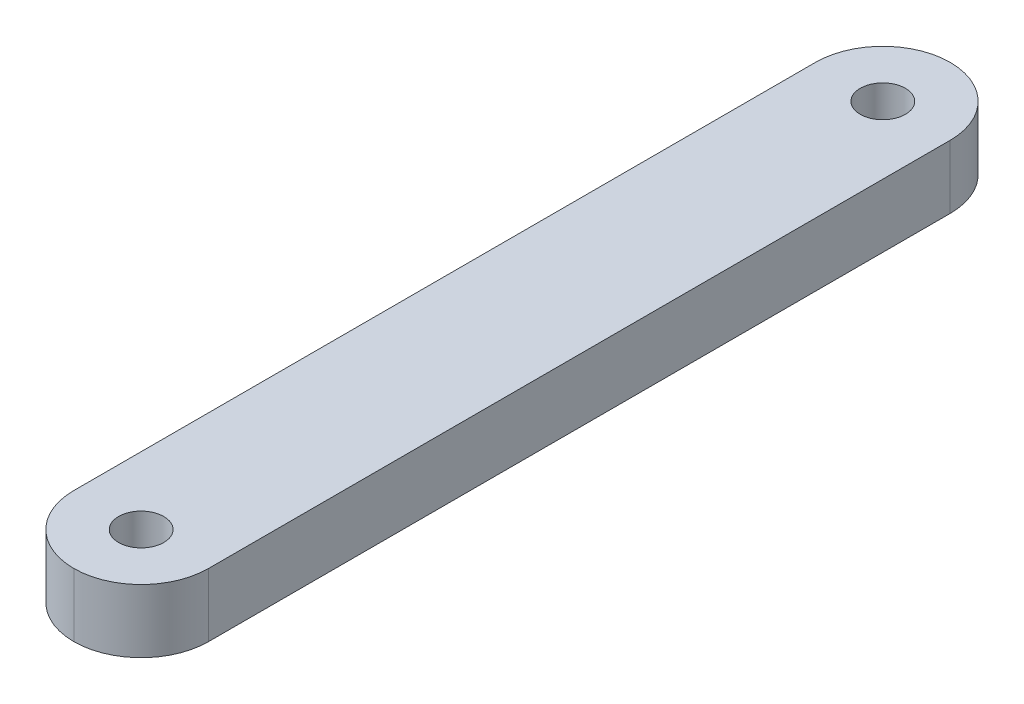
ISO-10303-21;
HEADER;
FILE_DESCRIPTION(('STEP AP214'),'2;1');
FILE_NAME('part.step','',(''),(''),'','','');
FILE_SCHEMA(('AUTOMOTIVE_DESIGN { 1 0 10303 214 1 1 1 1 }'));
ENDSEC;
DATA;
#1=APPLICATION_CONTEXT('core data for automotive mechanical design processes');
#2=APPLICATION_PROTOCOL_DEFINITION('international standard','automotive_design',2000,#1);
#3=PRODUCT_CONTEXT('',#1,'mechanical');
#4=PRODUCT('Part','Part','',(#3));
#5=PRODUCT_RELATED_PRODUCT_CATEGORY('part','',(#4));
#6=PRODUCT_DEFINITION_FORMATION('','',#4);
#7=PRODUCT_DEFINITION_CONTEXT('part definition',#1,'design');
#8=PRODUCT_DEFINITION('design','',#6,#7);
#9=PRODUCT_DEFINITION_SHAPE('','',#8);
#10=(LENGTH_UNIT() NAMED_UNIT(*) SI_UNIT(.MILLI.,.METRE.));
#11=(NAMED_UNIT(*) PLANE_ANGLE_UNIT() SI_UNIT($,.RADIAN.));
#12=(NAMED_UNIT(*) SI_UNIT($,.STERADIAN.) SOLID_ANGLE_UNIT());
#13=UNCERTAINTY_MEASURE_WITH_UNIT(LENGTH_MEASURE(1.E-05),#10,'distance_accuracy_value','');
#14=(GEOMETRIC_REPRESENTATION_CONTEXT(3) GLOBAL_UNCERTAINTY_ASSIGNED_CONTEXT((#13)) GLOBAL_UNIT_ASSIGNED_CONTEXT((#10,
#11,#12)) REPRESENTATION_CONTEXT('',''));
#15=CARTESIAN_POINT('',(0.,0.,0.));
#16=DIRECTION('',(0.,0.,1.));
#17=DIRECTION('',(1.,0.,0.));
#18=AXIS2_PLACEMENT_3D('',#15,#16,#17);
#19=CARTESIAN_POINT('',(0.,0.,65.));
#20=DIRECTION('',(1.,0.,0.));
#21=DIRECTION('',(0.,0.,-1.));
#22=AXIS2_PLACEMENT_3D('',#19,#20,#21);
#23=PLANE('',#22);
#24=DIRECTION('',(0.,0.,1.));
#25=VECTOR('',#24,1.);
#26=CARTESIAN_POINT('',(0.,4.7,65.));
#27=LINE('',#26,#25);
#28=CARTESIAN_POINT('',(0.,4.7,5.));
#29=VERTEX_POINT('',#28);
#30=CARTESIAN_POINT('',(0.,4.7,60.));
#31=VERTEX_POINT('',#30);
#32=EDGE_CURVE('E87',#29,#31,#27,.T.);
#33=ORIENTED_EDGE('',*,*,#32,.F.);
#34=DIRECTION('',(0.,-1.,0.));
#35=VECTOR('',#34,1.);
#36=CARTESIAN_POINT('',(0.,0.,5.));
#37=LINE('',#36,#35);
#38=CARTESIAN_POINT('',(0.,0.,5.));
#39=VERTEX_POINT('',#38);
#40=EDGE_CURVE('E56',#29,#39,#37,.T.);
#41=ORIENTED_EDGE('',*,*,#40,.T.);
#42=DIRECTION('',(0.,0.,-1.));
#43=VECTOR('',#42,1.);
#44=CARTESIAN_POINT('',(0.,0.,65.));
#45=LINE('',#44,#43);
#46=CARTESIAN_POINT('',(0.,0.,60.));
#47=VERTEX_POINT('',#46);
#48=EDGE_CURVE('E135',#47,#39,#45,.T.);
#49=ORIENTED_EDGE('',*,*,#48,.F.);
#50=DIRECTION('',(0.,-1.,0.));
#51=VECTOR('',#50,1.);
#52=CARTESIAN_POINT('',(0.,0.,60.));
#53=LINE('',#52,#51);
#54=EDGE_CURVE('E93',#47,#31,#53,.F.);
#55=ORIENTED_EDGE('',*,*,#54,.T.);
#56=EDGE_LOOP('',(#33,#41,#49,#55));
#57=FACE_BOUND('',#56,.T.);
#58=ADVANCED_FACE('F34',(#57),#23,.F.);
#59=CARTESIAN_POINT('',(10.,0.,65.));
#60=DIRECTION('',(-1.,0.,0.));
#61=DIRECTION('',(0.,0.,1.));
#62=AXIS2_PLACEMENT_3D('',#59,#60,#61);
#63=PLANE('',#62);
#64=DIRECTION('',(0.,0.,-1.));
#65=VECTOR('',#64,1.);
#66=CARTESIAN_POINT('',(10.,4.7,65.));
#67=LINE('',#66,#65);
#68=CARTESIAN_POINT('',(10.,4.7,60.));
#69=VERTEX_POINT('',#68);
#70=CARTESIAN_POINT('',(10.,4.7,5.));
#71=VERTEX_POINT('',#70);
#72=EDGE_CURVE('E95',#69,#71,#67,.T.);
#73=ORIENTED_EDGE('',*,*,#72,.F.);
#74=DIRECTION('',(0.,1.,0.));
#75=VECTOR('',#74,1.);
#76=CARTESIAN_POINT('',(10.,0.,60.));
#77=LINE('',#76,#75);
#78=CARTESIAN_POINT('',(10.,0.,60.));
#79=VERTEX_POINT('',#78);
#80=EDGE_CURVE('E42',#69,#79,#77,.F.);
#81=ORIENTED_EDGE('',*,*,#80,.T.);
#82=DIRECTION('',(0.,0.,-1.));
#83=VECTOR('',#82,1.);
#84=CARTESIAN_POINT('',(10.,0.,65.));
#85=LINE('',#84,#83);
#86=CARTESIAN_POINT('',(10.,0.,5.));
#87=VERTEX_POINT('',#86);
#88=EDGE_CURVE('E132',#79,#87,#85,.T.);
#89=ORIENTED_EDGE('',*,*,#88,.T.);
#90=DIRECTION('',(0.,1.,0.));
#91=VECTOR('',#90,1.);
#92=CARTESIAN_POINT('',(10.,5.,5.));
#93=LINE('',#92,#91);
#94=EDGE_CURVE('E103',#87,#71,#93,.T.);
#95=ORIENTED_EDGE('',*,*,#94,.T.);
#96=EDGE_LOOP('',(#73,#81,#89,#95));
#97=FACE_BOUND('',#96,.T.);
#98=ADVANCED_FACE('F159',(#97),#63,.F.);
#99=CARTESIAN_POINT('',(5.,-35.,60.));
#100=DIRECTION('',(0.,1.,0.));
#101=DIRECTION('',(0.,0.,1.));
#102=AXIS2_PLACEMENT_3D('',#99,#100,#101);
#103=CYLINDRICAL_SURFACE('',#102,1.675);
#104=CARTESIAN_POINT('',(5.,0.,60.));
#105=DIRECTION('',(0.,1.,0.));
#106=DIRECTION('',(0.,0.,1.));
#107=AXIS2_PLACEMENT_3D('',#104,#105,#106);
#108=CIRCLE('',#107,1.675);
#109=CARTESIAN_POINT('',(5.,0.,61.675));
#110=VERTEX_POINT('',#109);
#111=EDGE_CURVE('E114',#110,#110,#108,.T.);
#112=ORIENTED_EDGE('',*,*,#111,.F.);
#113=EDGE_LOOP('',(#112));
#114=FACE_BOUND('',#113,.T.);
#115=CARTESIAN_POINT('',(5.,4.7,60.));
#116=DIRECTION('',(0.,1.,0.));
#117=DIRECTION('',(0.,0.,1.));
#118=AXIS2_PLACEMENT_3D('',#115,#116,#117);
#119=CIRCLE('',#118,1.675);
#120=CARTESIAN_POINT('',(5.,4.7,61.675));
#121=VERTEX_POINT('',#120);
#122=EDGE_CURVE('E116',#121,#121,#119,.F.);
#123=ORIENTED_EDGE('',*,*,#122,.F.);
#124=EDGE_LOOP('',(#123));
#125=FACE_BOUND('',#124,.T.);
#126=ADVANCED_FACE('F161',(#114,#125),#103,.F.);
#127=CARTESIAN_POINT('',(5.,-35.,5.));
#128=DIRECTION('',(0.,1.,0.));
#129=DIRECTION('',(0.,0.,1.));
#130=AXIS2_PLACEMENT_3D('',#127,#128,#129);
#131=CYLINDRICAL_SURFACE('',#130,1.675);
#132=CARTESIAN_POINT('',(5.,0.,5.));
#133=DIRECTION('',(0.,1.,0.));
#134=DIRECTION('',(0.,0.,1.));
#135=AXIS2_PLACEMENT_3D('',#132,#133,#134);
#136=CIRCLE('',#135,1.675);
#137=CARTESIAN_POINT('',(5.,0.,6.675));
#138=VERTEX_POINT('',#137);
#139=EDGE_CURVE('E129',#138,#138,#136,.T.);
#140=ORIENTED_EDGE('',*,*,#139,.F.);
#141=EDGE_LOOP('',(#140));
#142=FACE_BOUND('',#141,.T.);
#143=CARTESIAN_POINT('',(5.,4.7,5.));
#144=DIRECTION('',(0.,1.,0.));
#145=DIRECTION('',(0.,0.,1.));
#146=AXIS2_PLACEMENT_3D('',#143,#144,#145);
#147=CIRCLE('',#146,1.675);
#148=CARTESIAN_POINT('',(5.,4.7,6.675));
#149=VERTEX_POINT('',#148);
#150=EDGE_CURVE('E118',#149,#149,#147,.F.);
#151=ORIENTED_EDGE('',*,*,#150,.F.);
#152=EDGE_LOOP('',(#151));
#153=FACE_BOUND('',#152,.T.);
#154=ADVANCED_FACE('F167',(#142,#153),#131,.F.);
#155=CARTESIAN_POINT('',(5.,0.,60.));
#156=DIRECTION('',(0.,1.,0.));
#157=DIRECTION('',(0.,0.,1.));
#158=AXIS2_PLACEMENT_3D('',#155,#156,#157);
#159=CYLINDRICAL_SURFACE('',#158,5.);
#160=ORIENTED_EDGE('',*,*,#80,.F.);
#161=CARTESIAN_POINT('',(5.,4.7,60.));
#162=DIRECTION('',(0.,1.,0.));
#163=DIRECTION('',(0.,0.,1.));
#164=AXIS2_PLACEMENT_3D('',#161,#162,#163);
#165=CIRCLE('',#164,5.);
#166=CARTESIAN_POINT('',(5.,4.7,65.));
#167=VERTEX_POINT('',#166);
#168=EDGE_CURVE('E123',#69,#167,#165,.F.);
#169=ORIENTED_EDGE('',*,*,#168,.T.);
#170=DIRECTION('',(0.,1.,0.));
#171=VECTOR('',#170,1.);
#172=CARTESIAN_POINT('',(5.,0.,65.));
#173=LINE('',#172,#171);
#174=CARTESIAN_POINT('',(5.,0.,65.));
#175=VERTEX_POINT('',#174);
#176=EDGE_CURVE('E112',#175,#167,#173,.T.);
#177=ORIENTED_EDGE('',*,*,#176,.F.);
#178=CARTESIAN_POINT('',(5.,0.,60.));
#179=DIRECTION('',(0.,1.,0.));
#180=DIRECTION('',(0.,0.,1.));
#181=AXIS2_PLACEMENT_3D('',#178,#179,#180);
#182=CIRCLE('',#181,5.);
#183=EDGE_CURVE('E105',#79,#175,#182,.F.);
#184=ORIENTED_EDGE('',*,*,#183,.F.);
#185=EDGE_LOOP('',(#160,#169,#177,#184));
#186=FACE_BOUND('',#185,.T.);
#187=ADVANCED_FACE('F148',(#186),#159,.T.);
#188=CARTESIAN_POINT('',(5.,0.,60.));
#189=DIRECTION('',(0.,-1.,0.));
#190=DIRECTION('',(0.,0.,-1.));
#191=AXIS2_PLACEMENT_3D('',#188,#189,#190);
#192=CYLINDRICAL_SURFACE('',#191,5.);
#193=ORIENTED_EDGE('',*,*,#176,.T.);
#194=CARTESIAN_POINT('',(5.,4.7,60.));
#195=DIRECTION('',(0.,1.,0.));
#196=DIRECTION('',(0.,0.,1.));
#197=AXIS2_PLACEMENT_3D('',#194,#195,#196);
#198=CIRCLE('',#197,5.);
#199=EDGE_CURVE('E94',#167,#31,#198,.F.);
#200=ORIENTED_EDGE('',*,*,#199,.T.);
#201=ORIENTED_EDGE('',*,*,#54,.F.);
#202=CARTESIAN_POINT('',(5.,0.,60.));
#203=DIRECTION('',(0.,1.,0.));
#204=DIRECTION('',(0.,0.,1.));
#205=AXIS2_PLACEMENT_3D('',#202,#203,#204);
#206=CIRCLE('',#205,5.);
#207=EDGE_CURVE('E101',#175,#47,#206,.F.);
#208=ORIENTED_EDGE('',*,*,#207,.F.);
#209=EDGE_LOOP('',(#193,#200,#201,#208));
#210=FACE_BOUND('',#209,.T.);
#211=ADVANCED_FACE('F150',(#210),#192,.T.);
#212=CARTESIAN_POINT('',(5.,0.,5.));
#213=DIRECTION('',(0.,-1.,0.));
#214=DIRECTION('',(0.,0.,-1.));
#215=AXIS2_PLACEMENT_3D('',#212,#213,#214);
#216=CYLINDRICAL_SURFACE('',#215,5.);
#217=DIRECTION('',(0.,1.,0.));
#218=VECTOR('',#217,1.);
#219=CARTESIAN_POINT('',(5.,0.,0.));
#220=LINE('',#219,#218);
#221=CARTESIAN_POINT('',(5.,4.7,0.));
#222=VERTEX_POINT('',#221);
#223=CARTESIAN_POINT('',(5.,0.,0.));
#224=VERTEX_POINT('',#223);
#225=EDGE_CURVE('E115',#222,#224,#220,.F.);
#226=ORIENTED_EDGE('',*,*,#225,.F.);
#227=CARTESIAN_POINT('',(5.,4.7,5.));
#228=DIRECTION('',(0.,1.,0.));
#229=DIRECTION('',(0.,0.,1.));
#230=AXIS2_PLACEMENT_3D('',#227,#228,#229);
#231=CIRCLE('',#230,5.);
#232=EDGE_CURVE('E49',#222,#71,#231,.F.);
#233=ORIENTED_EDGE('',*,*,#232,.T.);
#234=ORIENTED_EDGE('',*,*,#94,.F.);
#235=CARTESIAN_POINT('',(5.,0.,5.));
#236=DIRECTION('',(0.,1.,0.));
#237=DIRECTION('',(0.,0.,1.));
#238=AXIS2_PLACEMENT_3D('',#235,#236,#237);
#239=CIRCLE('',#238,5.);
#240=EDGE_CURVE('E137',#224,#87,#239,.F.);
#241=ORIENTED_EDGE('',*,*,#240,.F.);
#242=EDGE_LOOP('',(#226,#233,#234,#241));
#243=FACE_BOUND('',#242,.T.);
#244=ADVANCED_FACE('F36',(#243),#216,.T.);
#245=CARTESIAN_POINT('',(5.,0.,5.));
#246=DIRECTION('',(0.,1.,0.));
#247=DIRECTION('',(0.,0.,1.));
#248=AXIS2_PLACEMENT_3D('',#245,#246,#247);
#249=CYLINDRICAL_SURFACE('',#248,5.);
#250=ORIENTED_EDGE('',*,*,#40,.F.);
#251=CARTESIAN_POINT('',(5.,4.7,5.));
#252=DIRECTION('',(0.,1.,0.));
#253=DIRECTION('',(0.,0.,1.));
#254=AXIS2_PLACEMENT_3D('',#251,#252,#253);
#255=CIRCLE('',#254,5.);
#256=EDGE_CURVE('E11',#29,#222,#255,.F.);
#257=ORIENTED_EDGE('',*,*,#256,.T.);
#258=ORIENTED_EDGE('',*,*,#225,.T.);
#259=CARTESIAN_POINT('',(5.,0.,5.));
#260=DIRECTION('',(0.,1.,0.));
#261=DIRECTION('',(0.,0.,1.));
#262=AXIS2_PLACEMENT_3D('',#259,#260,#261);
#263=CIRCLE('',#262,5.);
#264=EDGE_CURVE('E99',#39,#224,#263,.F.);
#265=ORIENTED_EDGE('',*,*,#264,.F.);
#266=EDGE_LOOP('',(#250,#257,#258,#265));
#267=FACE_BOUND('',#266,.T.);
#268=ADVANCED_FACE('F97',(#267),#249,.T.);
#269=CARTESIAN_POINT('',(0.,0.,65.));
#270=DIRECTION('',(0.,1.,0.));
#271=DIRECTION('',(0.,0.,1.));
#272=AXIS2_PLACEMENT_3D('',#269,#270,#271);
#273=PLANE('',#272);
#274=ORIENTED_EDGE('',*,*,#139,.T.);
#275=EDGE_LOOP('',(#274));
#276=FACE_BOUND('',#275,.T.);
#277=ORIENTED_EDGE('',*,*,#111,.T.);
#278=EDGE_LOOP('',(#277));
#279=FACE_BOUND('',#278,.T.);
#280=ORIENTED_EDGE('',*,*,#183,.T.);
#281=ORIENTED_EDGE('',*,*,#207,.T.);
#282=ORIENTED_EDGE('',*,*,#48,.T.);
#283=ORIENTED_EDGE('',*,*,#264,.T.);
#284=ORIENTED_EDGE('',*,*,#240,.T.);
#285=ORIENTED_EDGE('',*,*,#88,.F.);
#286=EDGE_LOOP('',(#280,#281,#282,#283,#284,#285));
#287=FACE_BOUND('',#286,.T.);
#288=ADVANCED_FACE('F143',(#276,#279,#287),#273,.F.);
#289=CARTESIAN_POINT('',(0.,4.7,0.));
#290=DIRECTION('',(0.,1.,0.));
#291=DIRECTION('',(0.,0.,1.));
#292=AXIS2_PLACEMENT_3D('',#289,#290,#291);
#293=PLANE('',#292);
#294=ORIENTED_EDGE('',*,*,#72,.T.);
#295=ORIENTED_EDGE('',*,*,#232,.F.);
#296=ORIENTED_EDGE('',*,*,#256,.F.);
#297=ORIENTED_EDGE('',*,*,#32,.T.);
#298=ORIENTED_EDGE('',*,*,#199,.F.);
#299=ORIENTED_EDGE('',*,*,#168,.F.);
#300=EDGE_LOOP('',(#294,#295,#296,#297,#298,#299));
#301=FACE_BOUND('',#300,.T.);
#302=ORIENTED_EDGE('',*,*,#150,.T.);
#303=EDGE_LOOP('',(#302));
#304=FACE_BOUND('',#303,.T.);
#305=ORIENTED_EDGE('',*,*,#122,.T.);
#306=EDGE_LOOP('',(#305));
#307=FACE_BOUND('',#306,.T.);
#308=ADVANCED_FACE('F85',(#301,#304,#307),#293,.T.);
#309=CLOSED_SHELL('',(#58,#98,#126,#154,#187,#211,#244,#268,#288,#308));
#310=MANIFOLD_SOLID_BREP('B2',#309);
#311=ADVANCED_BREP_SHAPE_REPRESENTATION('',(#18,#310),#14);
#312=SHAPE_DEFINITION_REPRESENTATION(#9,#311);
ENDSEC;
END-ISO-10303-21;
